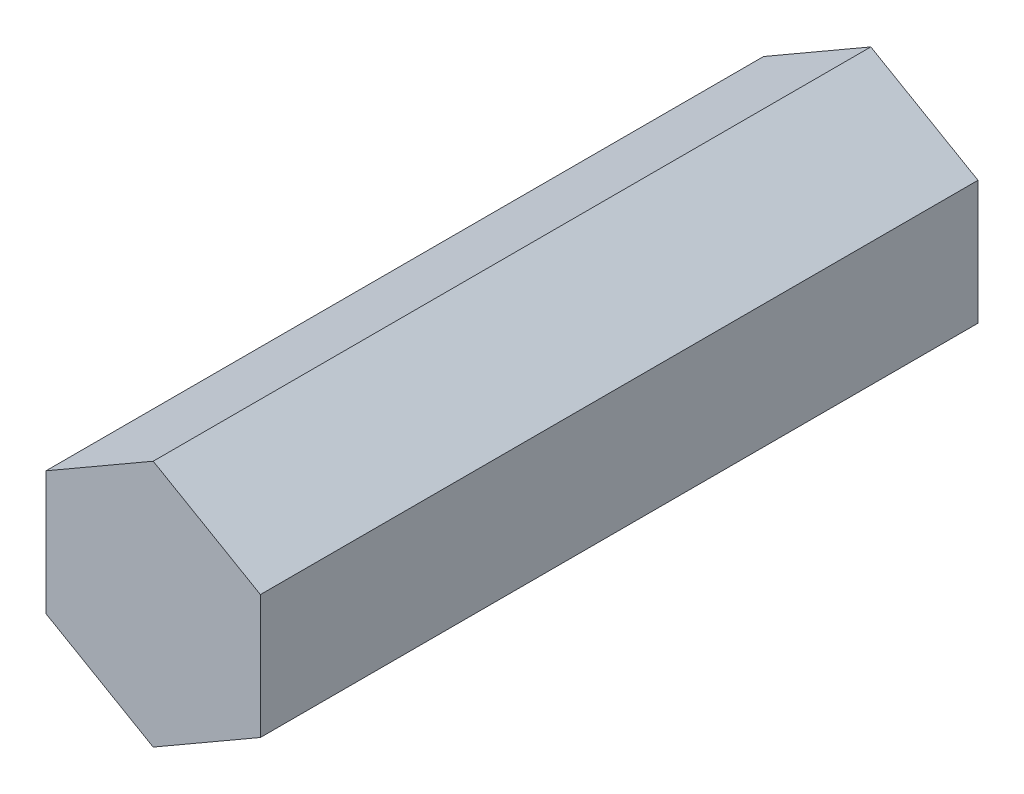
ISO-10303-21;
HEADER;
FILE_DESCRIPTION(('STEP AP214'),'2;1');
FILE_NAME('part.step','',(''),(''),'','','');
FILE_SCHEMA(('AUTOMOTIVE_DESIGN { 1 0 10303 214 1 1 1 1 }'));
ENDSEC;
DATA;
#1=APPLICATION_CONTEXT('core data for automotive mechanical design processes');
#2=APPLICATION_PROTOCOL_DEFINITION('international standard','automotive_design',2000,#1);
#3=PRODUCT_CONTEXT('',#1,'mechanical');
#4=PRODUCT('Part','Part','',(#3));
#5=PRODUCT_RELATED_PRODUCT_CATEGORY('part','',(#4));
#6=PRODUCT_DEFINITION_FORMATION('','',#4);
#7=PRODUCT_DEFINITION_CONTEXT('part definition',#1,'design');
#8=PRODUCT_DEFINITION('design','',#6,#7);
#9=PRODUCT_DEFINITION_SHAPE('','',#8);
#10=(LENGTH_UNIT() NAMED_UNIT(*) SI_UNIT(.MILLI.,.METRE.));
#11=(NAMED_UNIT(*) PLANE_ANGLE_UNIT() SI_UNIT($,.RADIAN.));
#12=(NAMED_UNIT(*) SI_UNIT($,.STERADIAN.) SOLID_ANGLE_UNIT());
#13=UNCERTAINTY_MEASURE_WITH_UNIT(LENGTH_MEASURE(1.E-05),#10,'distance_accuracy_value','');
#14=(GEOMETRIC_REPRESENTATION_CONTEXT(3) GLOBAL_UNCERTAINTY_ASSIGNED_CONTEXT((#13)) GLOBAL_UNIT_ASSIGNED_CONTEXT((#10,
#11,#12)) REPRESENTATION_CONTEXT('',''));
#15=CARTESIAN_POINT('',(0.,0.,0.));
#16=DIRECTION('',(0.,0.,1.));
#17=DIRECTION('',(1.,0.,0.));
#18=AXIS2_PLACEMENT_3D('',#15,#16,#17);
#19=CARTESIAN_POINT('',(5.97557528611257,3.45000000000006,40.));
#20=DIRECTION('',(-0.499999999999995,-0.866025403784442,0.));
#21=DIRECTION('',(0.866025403784442,-0.499999999999995,0.));
#22=AXIS2_PLACEMENT_3D('',#19,#20,#21);
#23=PLANE('',#22);
#24=DIRECTION('',(-0.866025403784442,0.499999999999995,0.));
#25=VECTOR('',#24,1.);
#26=CARTESIAN_POINT('',(5.97557528611257,3.45000000000006,0.));
#27=LINE('',#26,#25);
#28=CARTESIAN_POINT('',(5.97557528611257,3.45000000000006,0.));
#29=VERTEX_POINT('',#28);
#30=CARTESIAN_POINT('',(0.,6.89999999999999,0.));
#31=VERTEX_POINT('',#30);
#32=EDGE_CURVE('E128',#29,#31,#27,.T.);
#33=ORIENTED_EDGE('',*,*,#32,.T.);
#34=DIRECTION('',(0.,0.,-1.));
#35=VECTOR('',#34,1.);
#36=CARTESIAN_POINT('',(0.,6.89999999999999,40.));
#37=LINE('',#36,#35);
#38=CARTESIAN_POINT('',(0.,6.89999999999999,40.));
#39=VERTEX_POINT('',#38);
#40=EDGE_CURVE('E11',#39,#31,#37,.T.);
#41=ORIENTED_EDGE('',*,*,#40,.F.);
#42=DIRECTION('',(-0.866025403784442,0.499999999999995,0.));
#43=VECTOR('',#42,1.);
#44=CARTESIAN_POINT('',(5.97557528611257,3.45000000000006,40.));
#45=LINE('',#44,#43);
#46=CARTESIAN_POINT('',(5.97557528611257,3.45000000000006,40.));
#47=VERTEX_POINT('',#46);
#48=EDGE_CURVE('E144',#47,#39,#45,.T.);
#49=ORIENTED_EDGE('',*,*,#48,.F.);
#50=DIRECTION('',(0.,0.,-1.));
#51=VECTOR('',#50,1.);
#52=CARTESIAN_POINT('',(5.97557528611257,3.45000000000006,40.));
#53=LINE('',#52,#51);
#54=EDGE_CURVE('E124',#47,#29,#53,.T.);
#55=ORIENTED_EDGE('',*,*,#54,.T.);
#56=EDGE_LOOP('',(#33,#41,#49,#55));
#57=FACE_BOUND('',#56,.T.);
#58=ADVANCED_FACE('F39',(#57),#23,.F.);
#59=CARTESIAN_POINT('',(0.,6.89999999999999,40.));
#60=DIRECTION('',(0.500000000000001,-0.866025403784438,0.));
#61=DIRECTION('',(0.866025403784438,0.500000000000001,0.));
#62=AXIS2_PLACEMENT_3D('',#59,#60,#61);
#63=PLANE('',#62);
#64=DIRECTION('',(-0.866025403784438,-0.500000000000001,0.));
#65=VECTOR('',#64,1.);
#66=CARTESIAN_POINT('',(0.,6.89999999999999,0.));
#67=LINE('',#66,#65);
#68=CARTESIAN_POINT('',(-5.97557528611262,3.44999999999998,0.));
#69=VERTEX_POINT('',#68);
#70=EDGE_CURVE('E132',#31,#69,#67,.T.);
#71=ORIENTED_EDGE('',*,*,#70,.T.);
#72=DIRECTION('',(0.,0.,-1.));
#73=VECTOR('',#72,1.);
#74=CARTESIAN_POINT('',(-5.97557528611262,3.44999999999998,40.));
#75=LINE('',#74,#73);
#76=CARTESIAN_POINT('',(-5.97557528611262,3.44999999999998,40.));
#77=VERTEX_POINT('',#76);
#78=EDGE_CURVE('E48',#77,#69,#75,.T.);
#79=ORIENTED_EDGE('',*,*,#78,.F.);
#80=DIRECTION('',(-0.866025403784438,-0.500000000000001,0.));
#81=VECTOR('',#80,1.);
#82=CARTESIAN_POINT('',(0.,6.89999999999999,40.));
#83=LINE('',#82,#81);
#84=EDGE_CURVE('E93',#39,#77,#83,.T.);
#85=ORIENTED_EDGE('',*,*,#84,.F.);
#86=ORIENTED_EDGE('',*,*,#40,.T.);
#87=EDGE_LOOP('',(#71,#79,#85,#86));
#88=FACE_BOUND('',#87,.T.);
#89=ADVANCED_FACE('F172',(#88),#63,.F.);
#90=CARTESIAN_POINT('',(-5.97557528611262,3.44999999999998,40.));
#91=DIRECTION('',(1.,0.,0.));
#92=DIRECTION('',(0.,1.,0.));
#93=AXIS2_PLACEMENT_3D('',#90,#91,#92);
#94=PLANE('',#93);
#95=DIRECTION('',(0.,-1.,0.));
#96=VECTOR('',#95,1.);
#97=CARTESIAN_POINT('',(-5.97557528611262,3.44999999999998,0.));
#98=LINE('',#97,#96);
#99=CARTESIAN_POINT('',(-5.9755752861126,-3.45000000000002,0.));
#100=VERTEX_POINT('',#99);
#101=EDGE_CURVE('E135',#69,#100,#98,.T.);
#102=ORIENTED_EDGE('',*,*,#101,.T.);
#103=DIRECTION('',(0.,0.,-1.));
#104=VECTOR('',#103,1.);
#105=CARTESIAN_POINT('',(-5.9755752861126,-3.45000000000002,40.));
#106=LINE('',#105,#104);
#107=CARTESIAN_POINT('',(-5.9755752861126,-3.45000000000002,40.));
#108=VERTEX_POINT('',#107);
#109=EDGE_CURVE('E117',#108,#100,#106,.T.);
#110=ORIENTED_EDGE('',*,*,#109,.F.);
#111=DIRECTION('',(0.,-1.,0.));
#112=VECTOR('',#111,1.);
#113=CARTESIAN_POINT('',(-5.97557528611262,3.44999999999998,40.));
#114=LINE('',#113,#112);
#115=EDGE_CURVE('E106',#77,#108,#114,.T.);
#116=ORIENTED_EDGE('',*,*,#115,.F.);
#117=ORIENTED_EDGE('',*,*,#78,.T.);
#118=EDGE_LOOP('',(#102,#110,#116,#117));
#119=FACE_BOUND('',#118,.T.);
#120=ADVANCED_FACE('F154',(#119),#94,.F.);
#121=CARTESIAN_POINT('',(-5.9755752861126,-3.45000000000002,40.));
#122=DIRECTION('',(0.499999999999995,0.866025403784442,0.));
#123=DIRECTION('',(-0.866025403784442,0.499999999999995,0.));
#124=AXIS2_PLACEMENT_3D('',#121,#122,#123);
#125=PLANE('',#124);
#126=DIRECTION('',(0.866025403784441,-0.499999999999995,0.));
#127=VECTOR('',#126,1.);
#128=CARTESIAN_POINT('',(-5.9755752861126,-3.45000000000002,0.));
#129=LINE('',#128,#127);
#130=CARTESIAN_POINT('',(0.,-6.89999999999999,0.));
#131=VERTEX_POINT('',#130);
#132=EDGE_CURVE('E115',#100,#131,#129,.T.);
#133=ORIENTED_EDGE('',*,*,#132,.T.);
#134=DIRECTION('',(0.,0.,-1.));
#135=VECTOR('',#134,1.);
#136=CARTESIAN_POINT('',(0.,-6.89999999999999,40.));
#137=LINE('',#136,#135);
#138=CARTESIAN_POINT('',(0.,-6.89999999999999,40.));
#139=VERTEX_POINT('',#138);
#140=EDGE_CURVE('E112',#139,#131,#137,.T.);
#141=ORIENTED_EDGE('',*,*,#140,.F.);
#142=DIRECTION('',(0.866025403784441,-0.499999999999995,0.));
#143=VECTOR('',#142,1.);
#144=CARTESIAN_POINT('',(-5.9755752861126,-3.45000000000002,40.));
#145=LINE('',#144,#143);
#146=EDGE_CURVE('E100',#108,#139,#145,.T.);
#147=ORIENTED_EDGE('',*,*,#146,.F.);
#148=ORIENTED_EDGE('',*,*,#109,.T.);
#149=EDGE_LOOP('',(#133,#141,#147,#148));
#150=FACE_BOUND('',#149,.T.);
#151=ADVANCED_FACE('F113',(#150),#125,.F.);
#152=CARTESIAN_POINT('',(0.,-6.89999999999999,40.));
#153=DIRECTION('',(-0.500000000000007,0.866025403784434,0.));
#154=DIRECTION('',(-0.866025403784435,-0.500000000000007,0.));
#155=AXIS2_PLACEMENT_3D('',#152,#153,#154);
#156=PLANE('',#155);
#157=DIRECTION('',(0.866025403784435,0.500000000000007,0.));
#158=VECTOR('',#157,1.);
#159=CARTESIAN_POINT('',(0.,-6.89999999999999,0.));
#160=LINE('',#159,#158);
#161=CARTESIAN_POINT('',(5.97557528611265,-3.44999999999994,0.));
#162=VERTEX_POINT('',#161);
#163=EDGE_CURVE('E79',#131,#162,#160,.T.);
#164=ORIENTED_EDGE('',*,*,#163,.T.);
#165=DIRECTION('',(0.,0.,-1.));
#166=VECTOR('',#165,1.);
#167=CARTESIAN_POINT('',(5.97557528611265,-3.44999999999994,40.));
#168=LINE('',#167,#166);
#169=CARTESIAN_POINT('',(5.97557528611265,-3.44999999999994,40.));
#170=VERTEX_POINT('',#169);
#171=EDGE_CURVE('E118',#170,#162,#168,.T.);
#172=ORIENTED_EDGE('',*,*,#171,.F.);
#173=DIRECTION('',(0.866025403784435,0.500000000000007,0.));
#174=VECTOR('',#173,1.);
#175=CARTESIAN_POINT('',(0.,-6.89999999999999,40.));
#176=LINE('',#175,#174);
#177=EDGE_CURVE('E104',#139,#170,#176,.T.);
#178=ORIENTED_EDGE('',*,*,#177,.F.);
#179=ORIENTED_EDGE('',*,*,#140,.T.);
#180=EDGE_LOOP('',(#164,#172,#178,#179));
#181=FACE_BOUND('',#180,.T.);
#182=ADVANCED_FACE('F120',(#181),#156,.F.);
#183=CARTESIAN_POINT('',(5.97557528611265,-3.44999999999994,40.));
#184=DIRECTION('',(-1.,0.,0.));
#185=DIRECTION('',(0.,-1.,0.));
#186=AXIS2_PLACEMENT_3D('',#183,#184,#185);
#187=PLANE('',#186);
#188=DIRECTION('',(0.,1.,0.));
#189=VECTOR('',#188,1.);
#190=CARTESIAN_POINT('',(5.97557528611265,-3.44999999999994,0.));
#191=LINE('',#190,#189);
#192=EDGE_CURVE('E85',#162,#29,#191,.T.);
#193=ORIENTED_EDGE('',*,*,#192,.T.);
#194=ORIENTED_EDGE('',*,*,#54,.F.);
#195=DIRECTION('',(0.,1.,0.));
#196=VECTOR('',#195,1.);
#197=CARTESIAN_POINT('',(5.97557528611265,-3.44999999999994,40.));
#198=LINE('',#197,#196);
#199=EDGE_CURVE('E56',#170,#47,#198,.T.);
#200=ORIENTED_EDGE('',*,*,#199,.F.);
#201=ORIENTED_EDGE('',*,*,#171,.T.);
#202=EDGE_LOOP('',(#193,#194,#200,#201));
#203=FACE_BOUND('',#202,.T.);
#204=ADVANCED_FACE('F161',(#203),#187,.F.);
#205=CARTESIAN_POINT('',(0.,0.,40.));
#206=DIRECTION('',(0.,0.,1.));
#207=DIRECTION('',(1.,0.,0.));
#208=AXIS2_PLACEMENT_3D('',#205,#206,#207);
#209=PLANE('',#208);
#210=ORIENTED_EDGE('',*,*,#48,.T.);
#211=ORIENTED_EDGE('',*,*,#84,.T.);
#212=ORIENTED_EDGE('',*,*,#115,.T.);
#213=ORIENTED_EDGE('',*,*,#146,.T.);
#214=ORIENTED_EDGE('',*,*,#177,.T.);
#215=ORIENTED_EDGE('',*,*,#199,.T.);
#216=EDGE_LOOP('',(#210,#211,#212,#213,#214,#215));
#217=FACE_BOUND('',#216,.T.);
#218=ADVANCED_FACE('F102',(#217),#209,.T.);
#219=CARTESIAN_POINT('',(0.,0.,0.));
#220=DIRECTION('',(0.,0.,1.));
#221=DIRECTION('',(1.,0.,0.));
#222=AXIS2_PLACEMENT_3D('',#219,#220,#221);
#223=PLANE('',#222);
#224=ORIENTED_EDGE('',*,*,#32,.F.);
#225=ORIENTED_EDGE('',*,*,#192,.F.);
#226=ORIENTED_EDGE('',*,*,#163,.F.);
#227=ORIENTED_EDGE('',*,*,#132,.F.);
#228=ORIENTED_EDGE('',*,*,#101,.F.);
#229=ORIENTED_EDGE('',*,*,#70,.F.);
#230=EDGE_LOOP('',(#224,#225,#226,#227,#228,#229));
#231=FACE_BOUND('',#230,.T.);
#232=ADVANCED_FACE('F157',(#231),#223,.F.);
#233=CLOSED_SHELL('',(#58,#89,#120,#151,#182,#204,#218,#232));
#234=MANIFOLD_SOLID_BREP('B2',#233);
#235=ADVANCED_BREP_SHAPE_REPRESENTATION('',(#18,#234),#14);
#236=SHAPE_DEFINITION_REPRESENTATION(#9,#235);
ENDSEC;
END-ISO-10303-21;
